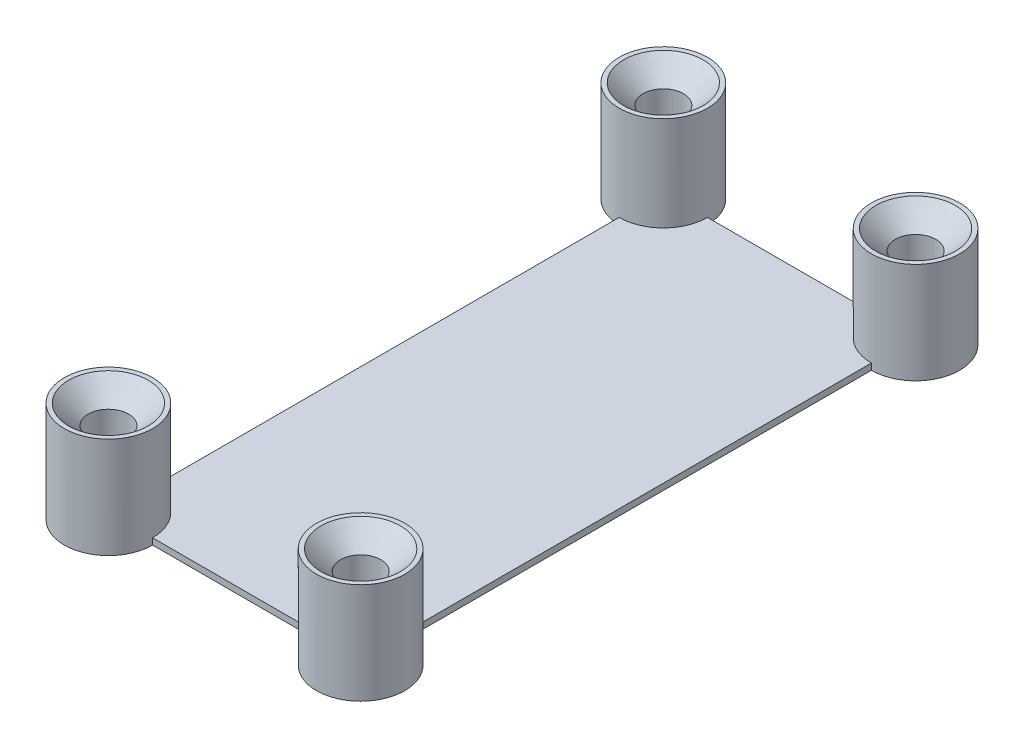
ISO-10303-21;
HEADER;
FILE_DESCRIPTION(('STEP AP214'),'2;1');
FILE_NAME('part.step','',(''),(''),'','','');
FILE_SCHEMA(('AUTOMOTIVE_DESIGN { 1 0 10303 214 1 1 1 1 }'));
ENDSEC;
DATA;
#1=APPLICATION_CONTEXT('core data for automotive mechanical design processes');
#2=APPLICATION_PROTOCOL_DEFINITION('international standard','automotive_design',2000,#1);
#3=PRODUCT_CONTEXT('',#1,'mechanical');
#4=PRODUCT('Part','Part','',(#3));
#5=PRODUCT_RELATED_PRODUCT_CATEGORY('part','',(#4));
#6=PRODUCT_DEFINITION_FORMATION('','',#4);
#7=PRODUCT_DEFINITION_CONTEXT('part definition',#1,'design');
#8=PRODUCT_DEFINITION('design','',#6,#7);
#9=PRODUCT_DEFINITION_SHAPE('','',#8);
#10=(LENGTH_UNIT() NAMED_UNIT(*) SI_UNIT(.MILLI.,.METRE.));
#11=(NAMED_UNIT(*) PLANE_ANGLE_UNIT() SI_UNIT($,.RADIAN.));
#12=(NAMED_UNIT(*) SI_UNIT($,.STERADIAN.) SOLID_ANGLE_UNIT());
#13=UNCERTAINTY_MEASURE_WITH_UNIT(LENGTH_MEASURE(1.E-05),#10,'distance_accuracy_value','');
#14=(GEOMETRIC_REPRESENTATION_CONTEXT(3) GLOBAL_UNCERTAINTY_ASSIGNED_CONTEXT((#13)) GLOBAL_UNIT_ASSIGNED_CONTEXT((#10,
#11,#12)) REPRESENTATION_CONTEXT('',''));
#15=CARTESIAN_POINT('',(0.,0.,0.));
#16=DIRECTION('',(0.,0.,1.));
#17=DIRECTION('',(1.,0.,0.));
#18=AXIS2_PLACEMENT_3D('',#15,#16,#17);
#19=CARTESIAN_POINT('',(0.,0.5,0.));
#20=DIRECTION('',(1.,0.,0.));
#21=DIRECTION('',(0.,0.,-1.));
#22=AXIS2_PLACEMENT_3D('',#19,#20,#21);
#23=PLANE('',#22);
#24=DIRECTION('',(0.,-1.,0.));
#25=VECTOR('',#24,1.);
#26=CARTESIAN_POINT('',(0.,8.,-40.5));
#27=LINE('',#26,#25);
#28=CARTESIAN_POINT('',(0.,0.,-40.5));
#29=VERTEX_POINT('',#28);
#30=CARTESIAN_POINT('',(0.,0.5,-40.5));
#31=VERTEX_POINT('',#30);
#32=EDGE_CURVE('E167',#29,#31,#27,.F.);
#33=ORIENTED_EDGE('',*,*,#32,.F.);
#34=DIRECTION('',(0.,0.,1.));
#35=VECTOR('',#34,1.);
#36=CARTESIAN_POINT('',(0.,0.,0.));
#37=LINE('',#36,#35);
#38=CARTESIAN_POINT('',(0.,0.,-3.5));
#39=VERTEX_POINT('',#38);
#40=EDGE_CURVE('E171',#29,#39,#37,.T.);
#41=ORIENTED_EDGE('',*,*,#40,.T.);
#42=DIRECTION('',(0.,-1.,0.));
#43=VECTOR('',#42,1.);
#44=CARTESIAN_POINT('',(0.,8.,-3.5));
#45=LINE('',#44,#43);
#46=CARTESIAN_POINT('',(0.,0.5,-3.5));
#47=VERTEX_POINT('',#46);
#48=EDGE_CURVE('E146',#47,#39,#45,.T.);
#49=ORIENTED_EDGE('',*,*,#48,.F.);
#50=DIRECTION('',(0.,0.,1.));
#51=VECTOR('',#50,1.);
#52=CARTESIAN_POINT('',(0.,0.5,0.));
#53=LINE('',#52,#51);
#54=EDGE_CURVE('E172',#31,#47,#53,.T.);
#55=ORIENTED_EDGE('',*,*,#54,.F.);
#56=EDGE_LOOP('',(#33,#41,#49,#55));
#57=FACE_BOUND('',#56,.T.);
#58=ADVANCED_FACE('F45',(#57),#23,.F.);
#59=CARTESIAN_POINT('',(0.,0.5,0.));
#60=DIRECTION('',(0.,0.,-1.));
#61=DIRECTION('',(-1.,0.,0.));
#62=AXIS2_PLACEMENT_3D('',#59,#60,#61);
#63=PLANE('',#62);
#64=DIRECTION('',(0.,-1.,0.));
#65=VECTOR('',#64,1.);
#66=CARTESIAN_POINT('',(16.5,8.,0.));
#67=LINE('',#66,#65);
#68=CARTESIAN_POINT('',(16.5,0.5,0.));
#69=VERTEX_POINT('',#68);
#70=CARTESIAN_POINT('',(16.5,0.,0.));
#71=VERTEX_POINT('',#70);
#72=EDGE_CURVE('E155',#69,#71,#67,.T.);
#73=ORIENTED_EDGE('',*,*,#72,.F.);
#74=DIRECTION('',(1.,0.,0.));
#75=VECTOR('',#74,1.);
#76=CARTESIAN_POINT('',(0.,0.5,0.));
#77=LINE('',#76,#75);
#78=CARTESIAN_POINT('',(3.5,0.5,0.));
#79=VERTEX_POINT('',#78);
#80=EDGE_CURVE('E112',#79,#69,#77,.T.);
#81=ORIENTED_EDGE('',*,*,#80,.F.);
#82=DIRECTION('',(0.,-1.,0.));
#83=VECTOR('',#82,1.);
#84=CARTESIAN_POINT('',(3.5,8.,0.));
#85=LINE('',#84,#83);
#86=CARTESIAN_POINT('',(3.5,0.,0.));
#87=VERTEX_POINT('',#86);
#88=EDGE_CURVE('E142',#87,#79,#85,.F.);
#89=ORIENTED_EDGE('',*,*,#88,.F.);
#90=DIRECTION('',(1.,0.,0.));
#91=VECTOR('',#90,1.);
#92=CARTESIAN_POINT('',(0.,0.,0.));
#93=LINE('',#92,#91);
#94=EDGE_CURVE('E180',#87,#71,#93,.T.);
#95=ORIENTED_EDGE('',*,*,#94,.T.);
#96=EDGE_LOOP('',(#73,#81,#89,#95));
#97=FACE_BOUND('',#96,.T.);
#98=ADVANCED_FACE('F281',(#97),#63,.F.);
#99=CARTESIAN_POINT('',(20.,0.5,0.));
#100=DIRECTION('',(-1.,0.,0.));
#101=DIRECTION('',(0.,0.,1.));
#102=AXIS2_PLACEMENT_3D('',#99,#100,#101);
#103=PLANE('',#102);
#104=DIRECTION('',(0.,-1.,0.));
#105=VECTOR('',#104,1.);
#106=CARTESIAN_POINT('',(20.,8.,-3.5));
#107=LINE('',#106,#105);
#108=CARTESIAN_POINT('',(20.,0.,-3.5));
#109=VERTEX_POINT('',#108);
#110=CARTESIAN_POINT('',(20.,0.5,-3.5));
#111=VERTEX_POINT('',#110);
#112=EDGE_CURVE('E152',#109,#111,#107,.F.);
#113=ORIENTED_EDGE('',*,*,#112,.F.);
#114=DIRECTION('',(0.,0.,-1.));
#115=VECTOR('',#114,1.);
#116=CARTESIAN_POINT('',(20.,0.,0.));
#117=LINE('',#116,#115);
#118=CARTESIAN_POINT('',(20.,0.,-40.5));
#119=VERTEX_POINT('',#118);
#120=EDGE_CURVE('E118',#109,#119,#117,.T.);
#121=ORIENTED_EDGE('',*,*,#120,.T.);
#122=DIRECTION('',(0.,-1.,0.));
#123=VECTOR('',#122,1.);
#124=CARTESIAN_POINT('',(20.,8.,-40.5));
#125=LINE('',#124,#123);
#126=CARTESIAN_POINT('',(20.,0.5,-40.5));
#127=VERTEX_POINT('',#126);
#128=EDGE_CURVE('E115',#127,#119,#125,.T.);
#129=ORIENTED_EDGE('',*,*,#128,.F.);
#130=DIRECTION('',(0.,0.,-1.));
#131=VECTOR('',#130,1.);
#132=CARTESIAN_POINT('',(20.,0.5,0.));
#133=LINE('',#132,#131);
#134=EDGE_CURVE('E54',#111,#127,#133,.T.);
#135=ORIENTED_EDGE('',*,*,#134,.F.);
#136=EDGE_LOOP('',(#113,#121,#129,#135));
#137=FACE_BOUND('',#136,.T.);
#138=ADVANCED_FACE('F116',(#137),#103,.F.);
#139=CARTESIAN_POINT('',(0.,0.5,-44.));
#140=DIRECTION('',(0.,0.,1.));
#141=DIRECTION('',(1.,0.,0.));
#142=AXIS2_PLACEMENT_3D('',#139,#140,#141);
#143=PLANE('',#142);
#144=DIRECTION('',(0.,-1.,0.));
#145=VECTOR('',#144,1.);
#146=CARTESIAN_POINT('',(3.5,8.,-44.));
#147=LINE('',#146,#145);
#148=CARTESIAN_POINT('',(3.5,0.5,-44.));
#149=VERTEX_POINT('',#148);
#150=CARTESIAN_POINT('',(3.5,0.,-44.));
#151=VERTEX_POINT('',#150);
#152=EDGE_CURVE('E163',#149,#151,#147,.T.);
#153=ORIENTED_EDGE('',*,*,#152,.F.);
#154=DIRECTION('',(-1.,0.,0.));
#155=VECTOR('',#154,1.);
#156=CARTESIAN_POINT('',(0.,0.5,-44.));
#157=LINE('',#156,#155);
#158=CARTESIAN_POINT('',(16.5,0.5,-44.));
#159=VERTEX_POINT('',#158);
#160=EDGE_CURVE('E11',#159,#149,#157,.T.);
#161=ORIENTED_EDGE('',*,*,#160,.F.);
#162=DIRECTION('',(0.,-1.,0.));
#163=VECTOR('',#162,1.);
#164=CARTESIAN_POINT('',(16.5,8.,-44.));
#165=LINE('',#164,#163);
#166=CARTESIAN_POINT('',(16.5,0.,-44.));
#167=VERTEX_POINT('',#166);
#168=EDGE_CURVE('E124',#167,#159,#165,.F.);
#169=ORIENTED_EDGE('',*,*,#168,.F.);
#170=DIRECTION('',(-1.,0.,0.));
#171=VECTOR('',#170,1.);
#172=CARTESIAN_POINT('',(0.,0.,-44.));
#173=LINE('',#172,#171);
#174=EDGE_CURVE('E175',#167,#151,#173,.T.);
#175=ORIENTED_EDGE('',*,*,#174,.T.);
#176=EDGE_LOOP('',(#153,#161,#169,#175));
#177=FACE_BOUND('',#176,.T.);
#178=ADVANCED_FACE('F270',(#177),#143,.F.);
#179=CARTESIAN_POINT('',(0.,0.5,0.));
#180=DIRECTION('',(0.,-1.,0.));
#181=DIRECTION('',(0.,0.,-1.));
#182=AXIS2_PLACEMENT_3D('',#179,#180,#181);
#183=PLANE('',#182);
#184=CARTESIAN_POINT('',(0.,0.5,-44.));
#185=DIRECTION('',(0.,-1.,0.));
#186=DIRECTION('',(0.,0.,-1.));
#187=AXIS2_PLACEMENT_3D('',#184,#185,#186);
#188=CIRCLE('',#187,3.5);
#189=EDGE_CURVE('E159',#31,#149,#188,.F.);
#190=ORIENTED_EDGE('',*,*,#189,.F.);
#191=ORIENTED_EDGE('',*,*,#54,.T.);
#192=CARTESIAN_POINT('',(0.,0.5,0.));
#193=DIRECTION('',(0.,-1.,0.));
#194=DIRECTION('',(0.,0.,-1.));
#195=AXIS2_PLACEMENT_3D('',#192,#193,#194);
#196=CIRCLE('',#195,3.5);
#197=EDGE_CURVE('E123',#79,#47,#196,.F.);
#198=ORIENTED_EDGE('',*,*,#197,.F.);
#199=ORIENTED_EDGE('',*,*,#80,.T.);
#200=CARTESIAN_POINT('',(20.,0.5,0.));
#201=DIRECTION('',(0.,-1.,0.));
#202=DIRECTION('',(0.,0.,-1.));
#203=AXIS2_PLACEMENT_3D('',#200,#201,#202);
#204=CIRCLE('',#203,3.5);
#205=EDGE_CURVE('E67',#111,#69,#204,.F.);
#206=ORIENTED_EDGE('',*,*,#205,.F.);
#207=ORIENTED_EDGE('',*,*,#134,.T.);
#208=CARTESIAN_POINT('',(20.,0.5,-44.));
#209=DIRECTION('',(0.,-1.,0.));
#210=DIRECTION('',(0.,0.,-1.));
#211=AXIS2_PLACEMENT_3D('',#208,#209,#210);
#212=CIRCLE('',#211,3.5);
#213=EDGE_CURVE('E61',#159,#127,#212,.F.);
#214=ORIENTED_EDGE('',*,*,#213,.F.);
#215=ORIENTED_EDGE('',*,*,#160,.T.);
#216=EDGE_LOOP('',(#190,#191,#198,#199,#206,#207,#214,#215));
#217=FACE_BOUND('',#216,.T.);
#218=ADVANCED_FACE('F108',(#217),#183,.F.);
#219=CARTESIAN_POINT('',(0.,0.,0.));
#220=DIRECTION('',(0.,-1.,0.));
#221=DIRECTION('',(0.,0.,-1.));
#222=AXIS2_PLACEMENT_3D('',#219,#220,#221);
#223=PLANE('',#222);
#224=CARTESIAN_POINT('',(20.,0.,-44.));
#225=DIRECTION('',(0.,-1.,0.));
#226=DIRECTION('',(0.,0.,-1.));
#227=AXIS2_PLACEMENT_3D('',#224,#225,#226);
#228=CIRCLE('',#227,1.6);
#229=CARTESIAN_POINT('',(20.,0.,-45.6));
#230=VERTEX_POINT('',#229);
#231=EDGE_CURVE('E48',#230,#230,#228,.T.);
#232=ORIENTED_EDGE('',*,*,#231,.F.);
#233=EDGE_LOOP('',(#232));
#234=FACE_BOUND('',#233,.T.);
#235=CARTESIAN_POINT('',(0.,0.,-44.));
#236=DIRECTION('',(0.,-1.,0.));
#237=DIRECTION('',(0.,0.,-1.));
#238=AXIS2_PLACEMENT_3D('',#235,#236,#237);
#239=CIRCLE('',#238,1.6);
#240=CARTESIAN_POINT('',(0.,0.,-45.6));
#241=VERTEX_POINT('',#240);
#242=EDGE_CURVE('E198',#241,#241,#239,.T.);
#243=ORIENTED_EDGE('',*,*,#242,.F.);
#244=EDGE_LOOP('',(#243));
#245=FACE_BOUND('',#244,.T.);
#246=CARTESIAN_POINT('',(0.,0.,0.));
#247=DIRECTION('',(0.,-1.,0.));
#248=DIRECTION('',(0.,0.,-1.));
#249=AXIS2_PLACEMENT_3D('',#246,#247,#248);
#250=CIRCLE('',#249,1.6);
#251=CARTESIAN_POINT('',(0.,0.,-1.6));
#252=VERTEX_POINT('',#251);
#253=EDGE_CURVE('E193',#252,#252,#250,.T.);
#254=ORIENTED_EDGE('',*,*,#253,.F.);
#255=EDGE_LOOP('',(#254));
#256=FACE_BOUND('',#255,.T.);
#257=CARTESIAN_POINT('',(20.,0.,0.));
#258=DIRECTION('',(0.,-1.,0.));
#259=DIRECTION('',(0.,0.,-1.));
#260=AXIS2_PLACEMENT_3D('',#257,#258,#259);
#261=CIRCLE('',#260,1.6);
#262=CARTESIAN_POINT('',(20.,0.,-1.6));
#263=VERTEX_POINT('',#262);
#264=EDGE_CURVE('E187',#263,#263,#261,.T.);
#265=ORIENTED_EDGE('',*,*,#264,.F.);
#266=EDGE_LOOP('',(#265));
#267=FACE_BOUND('',#266,.T.);
#268=ORIENTED_EDGE('',*,*,#40,.F.);
#269=CARTESIAN_POINT('',(0.,0.,-44.));
#270=DIRECTION('',(0.,1.,0.));
#271=DIRECTION('',(0.,0.,-1.));
#272=AXIS2_PLACEMENT_3D('',#269,#270,#271);
#273=CIRCLE('',#272,3.5);
#274=EDGE_CURVE('E236',#151,#29,#273,.T.);
#275=ORIENTED_EDGE('',*,*,#274,.F.);
#276=ORIENTED_EDGE('',*,*,#174,.F.);
#277=CARTESIAN_POINT('',(20.,0.,-44.));
#278=DIRECTION('',(0.,1.,0.));
#279=DIRECTION('',(0.,0.,1.));
#280=AXIS2_PLACEMENT_3D('',#277,#278,#279);
#281=CIRCLE('',#280,3.5);
#282=EDGE_CURVE('E135',#119,#167,#281,.T.);
#283=ORIENTED_EDGE('',*,*,#282,.F.);
#284=ORIENTED_EDGE('',*,*,#120,.F.);
#285=CARTESIAN_POINT('',(20.,0.,0.));
#286=DIRECTION('',(0.,1.,0.));
#287=DIRECTION('',(0.,0.,-1.));
#288=AXIS2_PLACEMENT_3D('',#285,#286,#287);
#289=CIRCLE('',#288,3.5);
#290=EDGE_CURVE('E244',#71,#109,#289,.T.);
#291=ORIENTED_EDGE('',*,*,#290,.F.);
#292=ORIENTED_EDGE('',*,*,#94,.F.);
#293=CARTESIAN_POINT('',(0.,0.,0.));
#294=DIRECTION('',(0.,1.,0.));
#295=DIRECTION('',(0.,0.,1.));
#296=AXIS2_PLACEMENT_3D('',#293,#294,#295);
#297=CIRCLE('',#296,3.5);
#298=EDGE_CURVE('E228',#39,#87,#297,.T.);
#299=ORIENTED_EDGE('',*,*,#298,.F.);
#300=EDGE_LOOP('',(#268,#275,#276,#283,#284,#291,#292,#299));
#301=FACE_BOUND('',#300,.T.);
#302=ADVANCED_FACE('F263',(#234,#245,#256,#267,#301),#223,.T.);
#303=CARTESIAN_POINT('',(20.,8.,-44.));
#304=DIRECTION('',(0.,-1.,0.));
#305=DIRECTION('',(0.,0.,-1.));
#306=AXIS2_PLACEMENT_3D('',#303,#304,#305);
#307=CYLINDRICAL_SURFACE('',#306,3.5);
#308=CARTESIAN_POINT('',(20.,8.,-44.));
#309=DIRECTION('',(0.,1.,0.));
#310=DIRECTION('',(0.,0.,1.));
#311=AXIS2_PLACEMENT_3D('',#308,#309,#310);
#312=CIRCLE('',#311,3.5);
#313=CARTESIAN_POINT('',(20.,8.,-40.5));
#314=VERTEX_POINT('',#313);
#315=EDGE_CURVE('E129',#314,#314,#312,.T.);
#316=ORIENTED_EDGE('',*,*,#315,.F.);
#317=EDGE_LOOP('',(#316));
#318=FACE_BOUND('',#317,.T.);
#319=ORIENTED_EDGE('',*,*,#213,.T.);
#320=ORIENTED_EDGE('',*,*,#128,.T.);
#321=ORIENTED_EDGE('',*,*,#282,.T.);
#322=ORIENTED_EDGE('',*,*,#168,.T.);
#323=EDGE_LOOP('',(#319,#320,#321,#322));
#324=FACE_BOUND('',#323,.T.);
#325=ADVANCED_FACE('F127',(#318,#324),#307,.T.);
#326=CARTESIAN_POINT('',(20.,8.,-44.));
#327=DIRECTION('',(0.,1.,0.));
#328=DIRECTION('',(0.,0.,1.));
#329=AXIS2_PLACEMENT_3D('',#326,#327,#328);
#330=PLANE('',#329);
#331=CARTESIAN_POINT('',(20.,8.,-44.));
#332=DIRECTION('',(0.,1.,0.));
#333=DIRECTION('',(0.,0.,1.));
#334=AXIS2_PLACEMENT_3D('',#331,#332,#333);
#335=CIRCLE('',#334,3.15);
#336=CARTESIAN_POINT('',(20.,8.,-40.85));
#337=VERTEX_POINT('',#336);
#338=EDGE_CURVE('E357',#337,#337,#335,.T.);
#339=ORIENTED_EDGE('',*,*,#338,.F.);
#340=EDGE_LOOP('',(#339));
#341=FACE_BOUND('',#340,.T.);
#342=ORIENTED_EDGE('',*,*,#315,.T.);
#343=EDGE_LOOP('',(#342));
#344=FACE_BOUND('',#343,.T.);
#345=ADVANCED_FACE('F298',(#341,#344),#330,.T.);
#346=CARTESIAN_POINT('',(0.,8.,0.));
#347=DIRECTION('',(0.,-1.,0.));
#348=DIRECTION('',(0.,0.,-1.));
#349=AXIS2_PLACEMENT_3D('',#346,#347,#348);
#350=CYLINDRICAL_SURFACE('',#349,3.5);
#351=CARTESIAN_POINT('',(0.,8.,0.));
#352=DIRECTION('',(0.,1.,0.));
#353=DIRECTION('',(0.,0.,1.));
#354=AXIS2_PLACEMENT_3D('',#351,#352,#353);
#355=CIRCLE('',#354,3.5);
#356=CARTESIAN_POINT('',(0.,8.,3.5));
#357=VERTEX_POINT('',#356);
#358=EDGE_CURVE('E191',#357,#357,#355,.T.);
#359=ORIENTED_EDGE('',*,*,#358,.F.);
#360=EDGE_LOOP('',(#359));
#361=FACE_BOUND('',#360,.T.);
#362=ORIENTED_EDGE('',*,*,#197,.T.);
#363=ORIENTED_EDGE('',*,*,#48,.T.);
#364=ORIENTED_EDGE('',*,*,#298,.T.);
#365=ORIENTED_EDGE('',*,*,#88,.T.);
#366=EDGE_LOOP('',(#362,#363,#364,#365));
#367=FACE_BOUND('',#366,.T.);
#368=ADVANCED_FACE('F278',(#361,#367),#350,.T.);
#369=CARTESIAN_POINT('',(0.,8.,0.));
#370=DIRECTION('',(0.,1.,0.));
#371=DIRECTION('',(0.,0.,1.));
#372=AXIS2_PLACEMENT_3D('',#369,#370,#371);
#373=PLANE('',#372);
#374=CARTESIAN_POINT('',(0.,8.,0.));
#375=DIRECTION('',(0.,1.,0.));
#376=DIRECTION('',(0.,0.,1.));
#377=AXIS2_PLACEMENT_3D('',#374,#375,#376);
#378=CIRCLE('',#377,3.15);
#379=CARTESIAN_POINT('',(0.,8.,3.15));
#380=VERTEX_POINT('',#379);
#381=EDGE_CURVE('E201',#380,#380,#378,.T.);
#382=ORIENTED_EDGE('',*,*,#381,.F.);
#383=EDGE_LOOP('',(#382));
#384=FACE_BOUND('',#383,.T.);
#385=ORIENTED_EDGE('',*,*,#358,.T.);
#386=EDGE_LOOP('',(#385));
#387=FACE_BOUND('',#386,.T.);
#388=ADVANCED_FACE('F257',(#384,#387),#373,.T.);
#389=CARTESIAN_POINT('',(20.,8.,0.));
#390=DIRECTION('',(0.,-1.,0.));
#391=DIRECTION('',(0.,0.,-1.));
#392=AXIS2_PLACEMENT_3D('',#389,#390,#391);
#393=CYLINDRICAL_SURFACE('',#392,3.5);
#394=CARTESIAN_POINT('',(20.,8.,0.));
#395=DIRECTION('',(0.,1.,0.));
#396=DIRECTION('',(0.,0.,-1.));
#397=AXIS2_PLACEMENT_3D('',#394,#395,#396);
#398=CIRCLE('',#397,3.5);
#399=CARTESIAN_POINT('',(20.,8.,-3.5));
#400=VERTEX_POINT('',#399);
#401=EDGE_CURVE('E232',#400,#400,#398,.T.);
#402=ORIENTED_EDGE('',*,*,#401,.F.);
#403=EDGE_LOOP('',(#402));
#404=FACE_BOUND('',#403,.T.);
#405=ORIENTED_EDGE('',*,*,#205,.T.);
#406=ORIENTED_EDGE('',*,*,#72,.T.);
#407=ORIENTED_EDGE('',*,*,#290,.T.);
#408=ORIENTED_EDGE('',*,*,#112,.T.);
#409=EDGE_LOOP('',(#405,#406,#407,#408));
#410=FACE_BOUND('',#409,.T.);
#411=ADVANCED_FACE('F254',(#404,#410),#393,.T.);
#412=CARTESIAN_POINT('',(20.,8.,0.));
#413=DIRECTION('',(0.,-1.,0.));
#414=DIRECTION('',(0.,0.,-1.));
#415=AXIS2_PLACEMENT_3D('',#412,#413,#414);
#416=PLANE('',#415);
#417=CARTESIAN_POINT('',(20.,8.,0.));
#418=DIRECTION('',(0.,1.,0.));
#419=DIRECTION('',(0.,0.,1.));
#420=AXIS2_PLACEMENT_3D('',#417,#418,#419);
#421=CIRCLE('',#420,3.15);
#422=CARTESIAN_POINT('',(20.,8.,3.15));
#423=VERTEX_POINT('',#422);
#424=EDGE_CURVE('E196',#423,#423,#421,.T.);
#425=ORIENTED_EDGE('',*,*,#424,.F.);
#426=EDGE_LOOP('',(#425));
#427=FACE_BOUND('',#426,.T.);
#428=ORIENTED_EDGE('',*,*,#401,.T.);
#429=EDGE_LOOP('',(#428));
#430=FACE_BOUND('',#429,.T.);
#431=ADVANCED_FACE('F252',(#427,#430),#416,.F.);
#432=CARTESIAN_POINT('',(0.,8.,-44.));
#433=DIRECTION('',(0.,-1.,0.));
#434=DIRECTION('',(0.,0.,-1.));
#435=AXIS2_PLACEMENT_3D('',#432,#433,#434);
#436=CYLINDRICAL_SURFACE('',#435,3.5);
#437=CARTESIAN_POINT('',(0.,8.,-44.));
#438=DIRECTION('',(0.,1.,0.));
#439=DIRECTION('',(0.,0.,-1.));
#440=AXIS2_PLACEMENT_3D('',#437,#438,#439);
#441=CIRCLE('',#440,3.5);
#442=CARTESIAN_POINT('',(0.,8.,-47.5));
#443=VERTEX_POINT('',#442);
#444=EDGE_CURVE('E240',#443,#443,#441,.T.);
#445=ORIENTED_EDGE('',*,*,#444,.F.);
#446=EDGE_LOOP('',(#445));
#447=FACE_BOUND('',#446,.T.);
#448=ORIENTED_EDGE('',*,*,#274,.T.);
#449=ORIENTED_EDGE('',*,*,#32,.T.);
#450=ORIENTED_EDGE('',*,*,#189,.T.);
#451=ORIENTED_EDGE('',*,*,#152,.T.);
#452=EDGE_LOOP('',(#448,#449,#450,#451));
#453=FACE_BOUND('',#452,.T.);
#454=ADVANCED_FACE('F272',(#447,#453),#436,.T.);
#455=CARTESIAN_POINT('',(0.,8.,-44.));
#456=DIRECTION('',(0.,-1.,0.));
#457=DIRECTION('',(0.,0.,-1.));
#458=AXIS2_PLACEMENT_3D('',#455,#456,#457);
#459=PLANE('',#458);
#460=CARTESIAN_POINT('',(0.,8.,-44.));
#461=DIRECTION('',(0.,1.,0.));
#462=DIRECTION('',(0.,0.,1.));
#463=AXIS2_PLACEMENT_3D('',#460,#461,#462);
#464=CIRCLE('',#463,3.15);
#465=CARTESIAN_POINT('',(0.,8.,-40.85));
#466=VERTEX_POINT('',#465);
#467=EDGE_CURVE('E210',#466,#466,#464,.T.);
#468=ORIENTED_EDGE('',*,*,#467,.F.);
#469=EDGE_LOOP('',(#468));
#470=FACE_BOUND('',#469,.T.);
#471=ORIENTED_EDGE('',*,*,#444,.T.);
#472=EDGE_LOOP('',(#471));
#473=FACE_BOUND('',#472,.T.);
#474=ADVANCED_FACE('F306',(#470,#473),#459,.F.);
#475=CARTESIAN_POINT('',(20.,8.,0.));
#476=DIRECTION('',(0.,1.,0.));
#477=DIRECTION('',(0.,0.,1.));
#478=AXIS2_PLACEMENT_3D('',#475,#476,#477);
#479=CYLINDRICAL_SURFACE('',#478,1.6);
#480=ORIENTED_EDGE('',*,*,#264,.T.);
#481=EDGE_LOOP('',(#480));
#482=FACE_BOUND('',#481,.T.);
#483=CARTESIAN_POINT('',(20.,6.45,0.));
#484=DIRECTION('',(0.,1.,0.));
#485=DIRECTION('',(0.,0.,1.));
#486=AXIS2_PLACEMENT_3D('',#483,#484,#485);
#487=CIRCLE('',#486,1.6);
#488=CARTESIAN_POINT('',(20.,6.45,1.6));
#489=VERTEX_POINT('',#488);
#490=EDGE_CURVE('E192',#489,#489,#487,.T.);
#491=ORIENTED_EDGE('',*,*,#490,.T.);
#492=EDGE_LOOP('',(#491));
#493=FACE_BOUND('',#492,.T.);
#494=ADVANCED_FACE('F309',(#482,#493),#479,.F.);
#495=CARTESIAN_POINT('',(20.,8.,0.));
#496=DIRECTION('',(0.,1.,0.));
#497=DIRECTION('',(0.,0.,1.));
#498=AXIS2_PLACEMENT_3D('',#495,#496,#497);
#499=CONICAL_SURFACE('',#498,3.15,0.785398163397448);
#500=ORIENTED_EDGE('',*,*,#490,.F.);
#501=EDGE_LOOP('',(#500));
#502=FACE_BOUND('',#501,.T.);
#503=ORIENTED_EDGE('',*,*,#424,.T.);
#504=EDGE_LOOP('',(#503));
#505=FACE_BOUND('',#504,.T.);
#506=ADVANCED_FACE('F322',(#502,#505),#499,.F.);
#507=CARTESIAN_POINT('',(0.,8.,0.));
#508=DIRECTION('',(0.,1.,0.));
#509=DIRECTION('',(0.,0.,1.));
#510=AXIS2_PLACEMENT_3D('',#507,#508,#509);
#511=CYLINDRICAL_SURFACE('',#510,1.6);
#512=ORIENTED_EDGE('',*,*,#253,.T.);
#513=EDGE_LOOP('',(#512));
#514=FACE_BOUND('',#513,.T.);
#515=CARTESIAN_POINT('',(0.,6.45,0.));
#516=DIRECTION('',(0.,1.,0.));
#517=DIRECTION('',(0.,0.,1.));
#518=AXIS2_PLACEMENT_3D('',#515,#516,#517);
#519=CIRCLE('',#518,1.6);
#520=CARTESIAN_POINT('',(0.,6.45,1.6));
#521=VERTEX_POINT('',#520);
#522=EDGE_CURVE('E197',#521,#521,#519,.T.);
#523=ORIENTED_EDGE('',*,*,#522,.T.);
#524=EDGE_LOOP('',(#523));
#525=FACE_BOUND('',#524,.T.);
#526=ADVANCED_FACE('F326',(#514,#525),#511,.F.);
#527=CARTESIAN_POINT('',(0.,8.,0.));
#528=DIRECTION('',(0.,1.,0.));
#529=DIRECTION('',(0.,0.,1.));
#530=AXIS2_PLACEMENT_3D('',#527,#528,#529);
#531=CONICAL_SURFACE('',#530,3.15,0.785398163397448);
#532=ORIENTED_EDGE('',*,*,#522,.F.);
#533=EDGE_LOOP('',(#532));
#534=FACE_BOUND('',#533,.T.);
#535=ORIENTED_EDGE('',*,*,#381,.T.);
#536=EDGE_LOOP('',(#535));
#537=FACE_BOUND('',#536,.T.);
#538=ADVANCED_FACE('F330',(#534,#537),#531,.F.);
#539=CARTESIAN_POINT('',(0.,8.,-44.));
#540=DIRECTION('',(0.,1.,0.));
#541=DIRECTION('',(0.,0.,1.));
#542=AXIS2_PLACEMENT_3D('',#539,#540,#541);
#543=CYLINDRICAL_SURFACE('',#542,1.6);
#544=ORIENTED_EDGE('',*,*,#242,.T.);
#545=EDGE_LOOP('',(#544));
#546=FACE_BOUND('',#545,.T.);
#547=CARTESIAN_POINT('',(0.,6.45,-44.));
#548=DIRECTION('',(0.,1.,0.));
#549=DIRECTION('',(0.,0.,1.));
#550=AXIS2_PLACEMENT_3D('',#547,#548,#549);
#551=CIRCLE('',#550,1.6);
#552=CARTESIAN_POINT('',(0.,6.45,-42.4));
#553=VERTEX_POINT('',#552);
#554=EDGE_CURVE('E202',#553,#553,#551,.T.);
#555=ORIENTED_EDGE('',*,*,#554,.T.);
#556=EDGE_LOOP('',(#555));
#557=FACE_BOUND('',#556,.T.);
#558=ADVANCED_FACE('F334',(#546,#557),#543,.F.);
#559=CARTESIAN_POINT('',(0.,8.,-44.));
#560=DIRECTION('',(0.,1.,0.));
#561=DIRECTION('',(0.,0.,1.));
#562=AXIS2_PLACEMENT_3D('',#559,#560,#561);
#563=CONICAL_SURFACE('',#562,3.15,0.785398163397448);
#564=ORIENTED_EDGE('',*,*,#554,.F.);
#565=EDGE_LOOP('',(#564));
#566=FACE_BOUND('',#565,.T.);
#567=ORIENTED_EDGE('',*,*,#467,.T.);
#568=EDGE_LOOP('',(#567));
#569=FACE_BOUND('',#568,.T.);
#570=ADVANCED_FACE('F338',(#566,#569),#563,.F.);
#571=CARTESIAN_POINT('',(20.,8.,-44.));
#572=DIRECTION('',(0.,1.,0.));
#573=DIRECTION('',(0.,0.,1.));
#574=AXIS2_PLACEMENT_3D('',#571,#572,#573);
#575=CYLINDRICAL_SURFACE('',#574,1.6);
#576=ORIENTED_EDGE('',*,*,#231,.T.);
#577=EDGE_LOOP('',(#576));
#578=FACE_BOUND('',#577,.T.);
#579=CARTESIAN_POINT('',(20.,6.45,-44.));
#580=DIRECTION('',(0.,1.,0.));
#581=DIRECTION('',(0.,0.,1.));
#582=AXIS2_PLACEMENT_3D('',#579,#580,#581);
#583=CIRCLE('',#582,1.6);
#584=CARTESIAN_POINT('',(20.,6.45,-42.4));
#585=VERTEX_POINT('',#584);
#586=EDGE_CURVE('E354',#585,#585,#583,.T.);
#587=ORIENTED_EDGE('',*,*,#586,.T.);
#588=EDGE_LOOP('',(#587));
#589=FACE_BOUND('',#588,.T.);
#590=ADVANCED_FACE('F341',(#578,#589),#575,.F.);
#591=CARTESIAN_POINT('',(20.,8.,-44.));
#592=DIRECTION('',(0.,1.,0.));
#593=DIRECTION('',(0.,0.,1.));
#594=AXIS2_PLACEMENT_3D('',#591,#592,#593);
#595=CONICAL_SURFACE('',#594,3.15,0.785398163397448);
#596=ORIENTED_EDGE('',*,*,#586,.F.);
#597=EDGE_LOOP('',(#596));
#598=FACE_BOUND('',#597,.T.);
#599=ORIENTED_EDGE('',*,*,#338,.T.);
#600=EDGE_LOOP('',(#599));
#601=FACE_BOUND('',#600,.T.);
#602=ADVANCED_FACE('F345',(#598,#601),#595,.F.);
#603=CLOSED_SHELL('',(#58,#98,#138,#178,#218,#302,#325,#345,#368,#388,#411,#431,#454,#474,#494,
#506,#526,#538,#558,#570,#590,#602));
#604=MANIFOLD_SOLID_BREP('B2',#603);
#605=ADVANCED_BREP_SHAPE_REPRESENTATION('',(#18,#604),#14);
#606=SHAPE_DEFINITION_REPRESENTATION(#9,#605);
ENDSEC;
END-ISO-10303-21;
